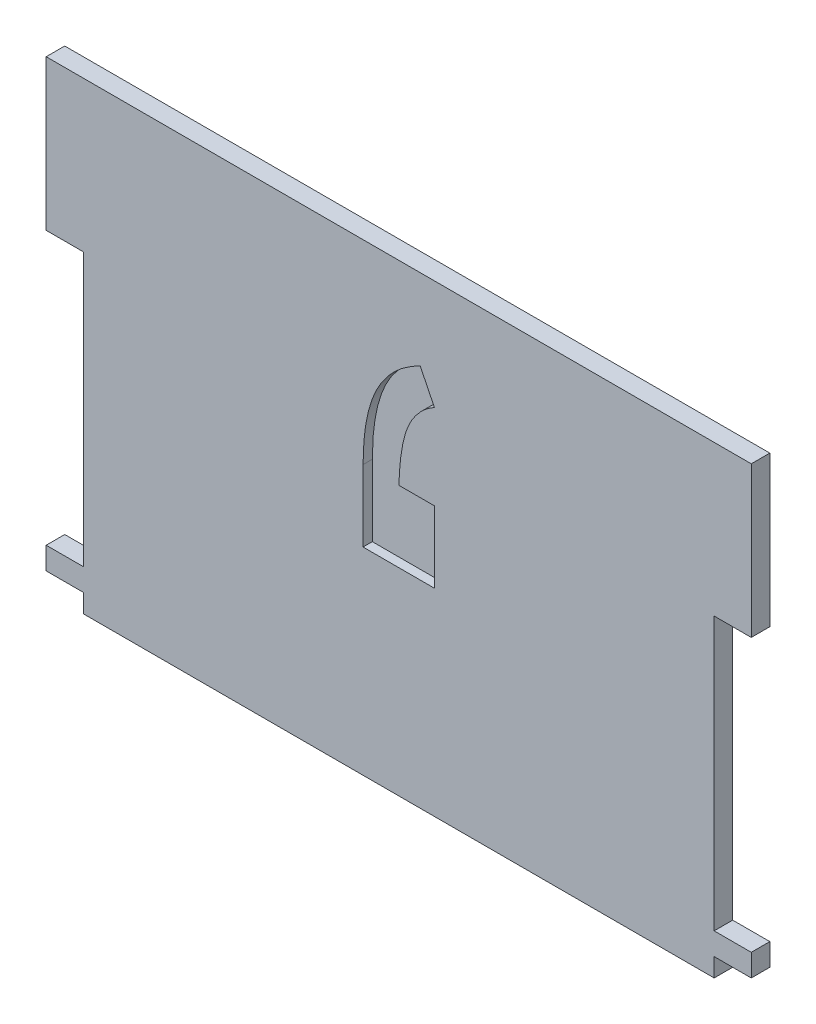
ISO-10303-21;
HEADER;
FILE_DESCRIPTION(('STEP AP214'),'2;1');
FILE_NAME('part.step','',(''),(''),'','','');
FILE_SCHEMA(('AUTOMOTIVE_DESIGN { 1 0 10303 214 1 1 1 1 }'));
ENDSEC;
DATA;
#1=APPLICATION_CONTEXT('core data for automotive mechanical design processes');
#2=APPLICATION_PROTOCOL_DEFINITION('international standard','automotive_design',2000,#1);
#3=PRODUCT_CONTEXT('',#1,'mechanical');
#4=PRODUCT('Part','Part','',(#3));
#5=PRODUCT_RELATED_PRODUCT_CATEGORY('part','',(#4));
#6=PRODUCT_DEFINITION_FORMATION('','',#4);
#7=PRODUCT_DEFINITION_CONTEXT('part definition',#1,'design');
#8=PRODUCT_DEFINITION('design','',#6,#7);
#9=PRODUCT_DEFINITION_SHAPE('','',#8);
#10=(LENGTH_UNIT() NAMED_UNIT(*) SI_UNIT(.MILLI.,.METRE.));
#11=(NAMED_UNIT(*) PLANE_ANGLE_UNIT() SI_UNIT($,.RADIAN.));
#12=(NAMED_UNIT(*) SI_UNIT($,.STERADIAN.) SOLID_ANGLE_UNIT());
#13=UNCERTAINTY_MEASURE_WITH_UNIT(LENGTH_MEASURE(1.E-05),#10,'distance_accuracy_value','');
#14=(GEOMETRIC_REPRESENTATION_CONTEXT(3) GLOBAL_UNCERTAINTY_ASSIGNED_CONTEXT((#13)) GLOBAL_UNIT_ASSIGNED_CONTEXT((#10,
#11,#12)) REPRESENTATION_CONTEXT('',''));
#15=CARTESIAN_POINT('',(0.,0.,0.));
#16=DIRECTION('',(0.,0.,1.));
#17=DIRECTION('',(1.,0.,0.));
#18=AXIS2_PLACEMENT_3D('',#15,#16,#17);
#19=CARTESIAN_POINT('',(0.,0.,1.));
#20=DIRECTION('',(0.,0.,-1.));
#21=DIRECTION('',(-1.,0.,0.));
#22=AXIS2_PLACEMENT_3D('',#19,#20,#21);
#23=PLANE('',#22);
#24=DIRECTION('',(1.,0.,0.));
#25=VECTOR('',#24,1.);
#26=CARTESIAN_POINT('',(-19.,1.5,1.));
#27=LINE('',#26,#25);
#28=CARTESIAN_POINT('',(-19.,1.5,1.));
#29=VERTEX_POINT('',#28);
#30=CARTESIAN_POINT('',(-17.,1.5,1.));
#31=VERTEX_POINT('',#30);
#32=EDGE_CURVE('E418',#29,#31,#27,.T.);
#33=ORIENTED_EDGE('',*,*,#32,.T.);
#34=DIRECTION('',(0.,-1.,0.));
#35=VECTOR('',#34,1.);
#36=CARTESIAN_POINT('',(-17.,1.5,1.));
#37=LINE('',#36,#35);
#38=CARTESIAN_POINT('',(-17.,0.5,1.));
#39=VERTEX_POINT('',#38);
#40=EDGE_CURVE('E466',#31,#39,#37,.T.);
#41=ORIENTED_EDGE('',*,*,#40,.T.);
#42=DIRECTION('',(1.,0.,0.));
#43=VECTOR('',#42,1.);
#44=CARTESIAN_POINT('',(-17.,0.5,1.));
#45=LINE('',#44,#43);
#46=CARTESIAN_POINT('',(17.,0.5,1.));
#47=VERTEX_POINT('',#46);
#48=EDGE_CURVE('E387',#39,#47,#45,.T.);
#49=ORIENTED_EDGE('',*,*,#48,.T.);
#50=DIRECTION('',(0.,1.,0.));
#51=VECTOR('',#50,1.);
#52=CARTESIAN_POINT('',(17.,0.5,1.));
#53=LINE('',#52,#51);
#54=CARTESIAN_POINT('',(17.,1.5,1.));
#55=VERTEX_POINT('',#54);
#56=EDGE_CURVE('E464',#47,#55,#53,.T.);
#57=ORIENTED_EDGE('',*,*,#56,.T.);
#58=DIRECTION('',(1.,0.,0.));
#59=VECTOR('',#58,1.);
#60=CARTESIAN_POINT('',(17.,1.5,1.));
#61=LINE('',#60,#59);
#62=CARTESIAN_POINT('',(19.,1.5,1.));
#63=VERTEX_POINT('',#62);
#64=EDGE_CURVE('E463',#55,#63,#61,.T.);
#65=ORIENTED_EDGE('',*,*,#64,.T.);
#66=DIRECTION('',(0.,1.,0.));
#67=VECTOR('',#66,1.);
#68=CARTESIAN_POINT('',(19.,1.5,1.));
#69=LINE('',#68,#67);
#70=CARTESIAN_POINT('',(19.,2.7,1.));
#71=VERTEX_POINT('',#70);
#72=EDGE_CURVE('E469',#63,#71,#69,.T.);
#73=ORIENTED_EDGE('',*,*,#72,.T.);
#74=DIRECTION('',(-1.,0.,0.));
#75=VECTOR('',#74,1.);
#76=CARTESIAN_POINT('',(19.,2.7,1.));
#77=LINE('',#76,#75);
#78=CARTESIAN_POINT('',(17.,2.7,1.));
#79=VERTEX_POINT('',#78);
#80=EDGE_CURVE('E474',#71,#79,#77,.T.);
#81=ORIENTED_EDGE('',*,*,#80,.T.);
#82=DIRECTION('',(0.,1.,0.));
#83=VECTOR('',#82,1.);
#84=CARTESIAN_POINT('',(17.,2.7,1.));
#85=LINE('',#84,#83);
#86=CARTESIAN_POINT('',(17.,17.3947217067352,1.));
#87=VERTEX_POINT('',#86);
#88=EDGE_CURVE('E477',#79,#87,#85,.T.);
#89=ORIENTED_EDGE('',*,*,#88,.T.);
#90=DIRECTION('',(1.,0.,0.));
#91=VECTOR('',#90,1.);
#92=CARTESIAN_POINT('',(17.,17.3947217067352,1.));
#93=LINE('',#92,#91);
#94=CARTESIAN_POINT('',(19.,17.3947217067352,1.));
#95=VERTEX_POINT('',#94);
#96=EDGE_CURVE('E480',#87,#95,#93,.T.);
#97=ORIENTED_EDGE('',*,*,#96,.T.);
#98=DIRECTION('',(0.,1.,0.));
#99=VECTOR('',#98,1.);
#100=CARTESIAN_POINT('',(19.,17.3947217067352,1.));
#101=LINE('',#100,#99);
#102=CARTESIAN_POINT('',(19.,25.5,1.));
#103=VERTEX_POINT('',#102);
#104=EDGE_CURVE('E478',#95,#103,#101,.T.);
#105=ORIENTED_EDGE('',*,*,#104,.T.);
#106=DIRECTION('',(-1.,0.,0.));
#107=VECTOR('',#106,1.);
#108=CARTESIAN_POINT('',(19.,25.5,1.));
#109=LINE('',#108,#107);
#110=CARTESIAN_POINT('',(-19.,25.5,1.));
#111=VERTEX_POINT('',#110);
#112=EDGE_CURVE('E482',#103,#111,#109,.T.);
#113=ORIENTED_EDGE('',*,*,#112,.T.);
#114=DIRECTION('',(0.,-1.,0.));
#115=VECTOR('',#114,1.);
#116=CARTESIAN_POINT('',(-19.,25.5,1.));
#117=LINE('',#116,#115);
#118=CARTESIAN_POINT('',(-19.,17.3947217067352,1.));
#119=VERTEX_POINT('',#118);
#120=EDGE_CURVE('E485',#111,#119,#117,.T.);
#121=ORIENTED_EDGE('',*,*,#120,.T.);
#122=DIRECTION('',(1.,0.,0.));
#123=VECTOR('',#122,1.);
#124=CARTESIAN_POINT('',(-19.,17.3947217067352,1.));
#125=LINE('',#124,#123);
#126=CARTESIAN_POINT('',(-17.,17.3947217067352,1.));
#127=VERTEX_POINT('',#126);
#128=EDGE_CURVE('E488',#119,#127,#125,.T.);
#129=ORIENTED_EDGE('',*,*,#128,.T.);
#130=DIRECTION('',(0.,-1.,0.));
#131=VECTOR('',#130,1.);
#132=CARTESIAN_POINT('',(-17.,17.3947217067352,1.));
#133=LINE('',#132,#131);
#134=CARTESIAN_POINT('',(-17.,2.7,1.));
#135=VERTEX_POINT('',#134);
#136=EDGE_CURVE('E486',#127,#135,#133,.T.);
#137=ORIENTED_EDGE('',*,*,#136,.T.);
#138=DIRECTION('',(-1.,0.,0.));
#139=VECTOR('',#138,1.);
#140=CARTESIAN_POINT('',(-17.,2.7,1.));
#141=LINE('',#140,#139);
#142=CARTESIAN_POINT('',(-19.,2.7,1.));
#143=VERTEX_POINT('',#142);
#144=EDGE_CURVE('E487',#135,#143,#141,.T.);
#145=ORIENTED_EDGE('',*,*,#144,.T.);
#146=DIRECTION('',(0.,-1.,0.));
#147=VECTOR('',#146,1.);
#148=CARTESIAN_POINT('',(-19.,2.7,1.));
#149=LINE('',#148,#147);
#150=EDGE_CURVE('E423',#143,#29,#149,.T.);
#151=ORIENTED_EDGE('',*,*,#150,.T.);
#152=EDGE_LOOP('',(#33,#41,#49,#57,#65,#73,#81,#89,#97,#105,#113,#121,#129,#137,#145,#151));
#153=FACE_BOUND('',#152,.T.);
#154=DIRECTION('',(1.,0.,0.));
#155=VECTOR('',#154,1.);
#156=CARTESIAN_POINT('',(0.0120192307692278,15.,1.));
#157=LINE('',#156,#155);
#158=CARTESIAN_POINT('',(0.0120192307692278,15.,1.));
#159=VERTEX_POINT('',#158);
#160=CARTESIAN_POINT('',(1.92307692307692,15.,1.));
#161=VERTEX_POINT('',#160);
#162=EDGE_CURVE('E53',#159,#161,#157,.T.);
#163=ORIENTED_EDGE('',*,*,#162,.T.);
#164=DIRECTION('',(0.,-1.,0.));
#165=VECTOR('',#164,1.);
#166=CARTESIAN_POINT('',(1.92307692307692,15.,1.));
#167=LINE('',#166,#165);
#168=CARTESIAN_POINT('',(1.92307692307692,11.1538461538462,1.));
#169=VERTEX_POINT('',#168);
#170=EDGE_CURVE('E263',#161,#169,#167,.T.);
#171=ORIENTED_EDGE('',*,*,#170,.T.);
#172=DIRECTION('',(-1.,0.,0.));
#173=VECTOR('',#172,1.);
#174=CARTESIAN_POINT('',(1.92307692307692,11.1538461538462,1.));
#175=LINE('',#174,#173);
#176=CARTESIAN_POINT('',(-1.92307692307693,11.1538461538462,1.));
#177=VERTEX_POINT('',#176);
#178=EDGE_CURVE('E256',#169,#177,#175,.T.);
#179=ORIENTED_EDGE('',*,*,#178,.T.);
#180=DIRECTION('',(0.,1.,0.));
#181=VECTOR('',#180,1.);
#182=CARTESIAN_POINT('',(-1.92307692307693,11.1538461538462,1.));
#183=LINE('',#182,#181);
#184=CARTESIAN_POINT('',(-1.92307692307693,15.,1.));
#185=VERTEX_POINT('',#184);
#186=EDGE_CURVE('E247',#177,#185,#183,.T.);
#187=ORIENTED_EDGE('',*,*,#186,.T.);
#188=CARTESIAN_POINT('',(-1.92307692307693,15.,1.));
#189=CARTESIAN_POINT('',(-1.91428347674863,15.3810505492982,1.));
#190=CARTESIAN_POINT('',(-1.89751173149341,16.1078284818168,1.));
#191=CARTESIAN_POINT('',(-1.76072914102215,17.1397191595459,1.));
#192=CARTESIAN_POINT('',(-1.53538346627234,18.0567557613417,1.));
#193=CARTESIAN_POINT('',(-1.21810162011556,18.870165784164,1.));
#194=CARTESIAN_POINT('',(-0.781937433708109,19.5779612250893,1.));
#195=CARTESIAN_POINT('',(-0.24573425601302,20.2023609067078,1.));
#196=CARTESIAN_POINT('',(0.404415870603687,20.7374611649171,1.));
#197=CARTESIAN_POINT('',(0.900608510826339,21.0131468045631,1.));
#198=CARTESIAN_POINT('',(1.15384615384615,21.1538461538462,1.));
#199=B_SPLINE_CURVE_WITH_KNOTS('',3,(#188,#189,#190,#191,#192,#193,#194,#195,#196,#197,#198),
.UNSPECIFIED.,.F.,.F.,(4,1,1,1,1,1,1,1,4),(0.,0.156605034796312,0.298692873218196,
0.426919608278893,0.544057561394536,0.656057591228239,0.766995985444929,0.881083710887764,1.),.UNSPECIFIED.);
#200=CARTESIAN_POINT('',(1.15384615384615,21.1538461538462,1.));
#201=VERTEX_POINT('',#200);
#202=EDGE_CURVE('E241',#185,#201,#199,.T.);
#203=ORIENTED_EDGE('',*,*,#202,.T.);
#204=DIRECTION('',(0.441684025127649,-0.897170676040539,0.));
#205=VECTOR('',#204,1.);
#206=CARTESIAN_POINT('',(1.15384615384615,21.1538461538462,1.));
#207=LINE('',#206,#205);
#208=CARTESIAN_POINT('',(1.92307692307692,19.5913461538462,1.));
#209=VERTEX_POINT('',#208);
#210=EDGE_CURVE('E230',#201,#209,#207,.T.);
#211=ORIENTED_EDGE('',*,*,#210,.T.);
#212=CARTESIAN_POINT('',(1.92307692307692,19.5913461538462,1.));
#213=CARTESIAN_POINT('',(1.77094286688164,19.4963447049698,1.));
#214=CARTESIAN_POINT('',(1.46819876928715,19.3072934916549,1.));
#215=CARTESIAN_POINT('',(1.08303359543179,18.9313058475956,1.));
#216=CARTESIAN_POINT('',(0.751943484761724,18.5007358504448,1.));
#217=CARTESIAN_POINT('',(0.489822240621816,17.9940203563104,1.));
#218=CARTESIAN_POINT('',(0.290655303004371,17.3979837252399,1.));
#219=CARTESIAN_POINT('',(0.147350709441592,16.6998755972471,1.));
#220=CARTESIAN_POINT('',(0.0437232804345663,15.8882556517103,1.));
#221=CARTESIAN_POINT('',(0.0230431865287676,15.3088593132732,1.));
#222=CARTESIAN_POINT('',(0.0120192307692278,15.,1.));
#223=B_SPLINE_CURVE_WITH_KNOTS('',3,(#212,#213,#214,#215,#216,#217,#218,#219,#220,#221,#222),
.UNSPECIFIED.,.F.,.F.,(4,1,1,1,1,1,1,1,4),(0.,0.102774668661639,0.204519784048887,
0.307171967567144,0.413723555049608,0.53054363811896,0.667099473035639,0.822540424705056,1.),.UNSPECIFIED.);
#224=EDGE_CURVE('E240',#209,#159,#223,.T.);
#225=ORIENTED_EDGE('',*,*,#224,.T.);
#226=EDGE_LOOP('',(#163,#171,#179,#187,#203,#211,#225));
#227=FACE_BOUND('',#226,.T.);
#228=ADVANCED_FACE('F39',(#153,#227),#23,.F.);
#229=CARTESIAN_POINT('',(0.,0.,0.));
#230=DIRECTION('',(0.,0.,-1.));
#231=DIRECTION('',(-1.,0.,0.));
#232=AXIS2_PLACEMENT_3D('',#229,#230,#231);
#233=PLANE('',#232);
#234=DIRECTION('',(1.,0.,0.));
#235=VECTOR('',#234,1.);
#236=CARTESIAN_POINT('',(-19.,1.5,0.));
#237=LINE('',#236,#235);
#238=CARTESIAN_POINT('',(-19.,1.5,0.));
#239=VERTEX_POINT('',#238);
#240=CARTESIAN_POINT('',(-17.,1.5,0.));
#241=VERTEX_POINT('',#240);
#242=EDGE_CURVE('E385',#239,#241,#237,.T.);
#243=ORIENTED_EDGE('',*,*,#242,.F.);
#244=DIRECTION('',(0.,-1.,0.));
#245=VECTOR('',#244,1.);
#246=CARTESIAN_POINT('',(-19.,2.7,0.));
#247=LINE('',#246,#245);
#248=CARTESIAN_POINT('',(-19.,2.7,0.));
#249=VERTEX_POINT('',#248);
#250=EDGE_CURVE('E419',#249,#239,#247,.T.);
#251=ORIENTED_EDGE('',*,*,#250,.F.);
#252=DIRECTION('',(-1.,0.,0.));
#253=VECTOR('',#252,1.);
#254=CARTESIAN_POINT('',(-17.,2.7,0.));
#255=LINE('',#254,#253);
#256=CARTESIAN_POINT('',(-17.,2.7,0.));
#257=VERTEX_POINT('',#256);
#258=EDGE_CURVE('E417',#257,#249,#255,.T.);
#259=ORIENTED_EDGE('',*,*,#258,.F.);
#260=DIRECTION('',(0.,-1.,0.));
#261=VECTOR('',#260,1.);
#262=CARTESIAN_POINT('',(-17.,17.3947217067352,0.));
#263=LINE('',#262,#261);
#264=CARTESIAN_POINT('',(-17.,17.3947217067352,0.));
#265=VERTEX_POINT('',#264);
#266=EDGE_CURVE('E413',#265,#257,#263,.T.);
#267=ORIENTED_EDGE('',*,*,#266,.F.);
#268=DIRECTION('',(1.,0.,0.));
#269=VECTOR('',#268,1.);
#270=CARTESIAN_POINT('',(-19.,17.3947217067352,0.));
#271=LINE('',#270,#269);
#272=CARTESIAN_POINT('',(-19.,17.3947217067352,0.));
#273=VERTEX_POINT('',#272);
#274=EDGE_CURVE('E415',#273,#265,#271,.T.);
#275=ORIENTED_EDGE('',*,*,#274,.F.);
#276=DIRECTION('',(0.,-1.,0.));
#277=VECTOR('',#276,1.);
#278=CARTESIAN_POINT('',(-19.,25.5,0.));
#279=LINE('',#278,#277);
#280=CARTESIAN_POINT('',(-19.,25.5,0.));
#281=VERTEX_POINT('',#280);
#282=EDGE_CURVE('E409',#281,#273,#279,.T.);
#283=ORIENTED_EDGE('',*,*,#282,.F.);
#284=DIRECTION('',(-1.,0.,0.));
#285=VECTOR('',#284,1.);
#286=CARTESIAN_POINT('',(19.,25.5,0.));
#287=LINE('',#286,#285);
#288=CARTESIAN_POINT('',(19.,25.5,0.));
#289=VERTEX_POINT('',#288);
#290=EDGE_CURVE('E408',#289,#281,#287,.T.);
#291=ORIENTED_EDGE('',*,*,#290,.F.);
#292=DIRECTION('',(0.,1.,0.));
#293=VECTOR('',#292,1.);
#294=CARTESIAN_POINT('',(19.,17.3947217067352,0.));
#295=LINE('',#294,#293);
#296=CARTESIAN_POINT('',(19.,17.3947217067352,0.));
#297=VERTEX_POINT('',#296);
#298=EDGE_CURVE('E406',#297,#289,#295,.T.);
#299=ORIENTED_EDGE('',*,*,#298,.F.);
#300=DIRECTION('',(1.,0.,0.));
#301=VECTOR('',#300,1.);
#302=CARTESIAN_POINT('',(17.,17.3947217067352,0.));
#303=LINE('',#302,#301);
#304=CARTESIAN_POINT('',(17.,17.3947217067352,0.));
#305=VERTEX_POINT('',#304);
#306=EDGE_CURVE('E402',#305,#297,#303,.T.);
#307=ORIENTED_EDGE('',*,*,#306,.F.);
#308=DIRECTION('',(0.,1.,0.));
#309=VECTOR('',#308,1.);
#310=CARTESIAN_POINT('',(17.,2.7,0.));
#311=LINE('',#310,#309);
#312=CARTESIAN_POINT('',(17.,2.7,0.));
#313=VERTEX_POINT('',#312);
#314=EDGE_CURVE('E405',#313,#305,#311,.T.);
#315=ORIENTED_EDGE('',*,*,#314,.F.);
#316=DIRECTION('',(-1.,0.,0.));
#317=VECTOR('',#316,1.);
#318=CARTESIAN_POINT('',(19.,2.7,0.));
#319=LINE('',#318,#317);
#320=CARTESIAN_POINT('',(19.,2.7,0.));
#321=VERTEX_POINT('',#320);
#322=EDGE_CURVE('E397',#321,#313,#319,.T.);
#323=ORIENTED_EDGE('',*,*,#322,.F.);
#324=DIRECTION('',(0.,1.,0.));
#325=VECTOR('',#324,1.);
#326=CARTESIAN_POINT('',(19.,1.5,0.));
#327=LINE('',#326,#325);
#328=CARTESIAN_POINT('',(19.,1.5,0.));
#329=VERTEX_POINT('',#328);
#330=EDGE_CURVE('E396',#329,#321,#327,.T.);
#331=ORIENTED_EDGE('',*,*,#330,.F.);
#332=DIRECTION('',(1.,0.,0.));
#333=VECTOR('',#332,1.);
#334=CARTESIAN_POINT('',(17.,1.5,0.));
#335=LINE('',#334,#333);
#336=CARTESIAN_POINT('',(17.,1.5,0.));
#337=VERTEX_POINT('',#336);
#338=EDGE_CURVE('E391',#337,#329,#335,.T.);
#339=ORIENTED_EDGE('',*,*,#338,.F.);
#340=DIRECTION('',(0.,1.,0.));
#341=VECTOR('',#340,1.);
#342=CARTESIAN_POINT('',(17.,0.5,0.));
#343=LINE('',#342,#341);
#344=CARTESIAN_POINT('',(17.,0.5,0.));
#345=VERTEX_POINT('',#344);
#346=EDGE_CURVE('E393',#345,#337,#343,.T.);
#347=ORIENTED_EDGE('',*,*,#346,.F.);
#348=DIRECTION('',(1.,0.,0.));
#349=VECTOR('',#348,1.);
#350=CARTESIAN_POINT('',(-17.,0.5,0.));
#351=LINE('',#350,#349);
#352=CARTESIAN_POINT('',(-17.,0.5,0.));
#353=VERTEX_POINT('',#352);
#354=EDGE_CURVE('E382',#353,#345,#351,.T.);
#355=ORIENTED_EDGE('',*,*,#354,.F.);
#356=DIRECTION('',(0.,-1.,0.));
#357=VECTOR('',#356,1.);
#358=CARTESIAN_POINT('',(-17.,1.5,0.));
#359=LINE('',#358,#357);
#360=EDGE_CURVE('E371',#241,#353,#359,.T.);
#361=ORIENTED_EDGE('',*,*,#360,.F.);
#362=EDGE_LOOP('',(#243,#251,#259,#267,#275,#283,#291,#299,#307,#315,#323,#331,#339,#347,#355,#361));
#363=FACE_BOUND('',#362,.T.);
#364=DIRECTION('',(0.,-1.,0.));
#365=VECTOR('',#364,1.);
#366=CARTESIAN_POINT('',(-1.92307692307691,6.92307692307692,0.));
#367=LINE('',#366,#365);
#368=CARTESIAN_POINT('',(-1.92307692307691,6.92307692307692,0.));
#369=VERTEX_POINT('',#368);
#370=CARTESIAN_POINT('',(-1.92307692307691,3.07692307692308,0.));
#371=VERTEX_POINT('',#370);
#372=EDGE_CURVE('E541',#369,#371,#367,.T.);
#373=ORIENTED_EDGE('',*,*,#372,.T.);
#374=DIRECTION('',(1.,0.,0.));
#375=VECTOR('',#374,1.);
#376=CARTESIAN_POINT('',(-1.92307692307691,3.07692307692308,0.));
#377=LINE('',#376,#375);
#378=CARTESIAN_POINT('',(1.92307692307694,3.07692307692308,0.));
#379=VERTEX_POINT('',#378);
#380=EDGE_CURVE('E64',#371,#379,#377,.T.);
#381=ORIENTED_EDGE('',*,*,#380,.T.);
#382=DIRECTION('',(0.,1.,0.));
#383=VECTOR('',#382,1.);
#384=CARTESIAN_POINT('',(1.92307692307694,3.07692307692308,0.));
#385=LINE('',#384,#383);
#386=CARTESIAN_POINT('',(1.92307692307694,6.92307692307692,0.));
#387=VERTEX_POINT('',#386);
#388=EDGE_CURVE('E547',#379,#387,#385,.T.);
#389=ORIENTED_EDGE('',*,*,#388,.T.);
#390=DIRECTION('',(-1.,0.,0.));
#391=VECTOR('',#390,1.);
#392=CARTESIAN_POINT('',(1.92307692307694,6.92307692307692,0.));
#393=LINE('',#392,#391);
#394=EDGE_CURVE('E544',#387,#369,#393,.T.);
#395=ORIENTED_EDGE('',*,*,#394,.T.);
#396=EDGE_LOOP('',(#373,#381,#389,#395));
#397=FACE_BOUND('',#396,.T.);
#398=ADVANCED_FACE('F308',(#363,#397),#233,.T.);
#399=CARTESIAN_POINT('',(-19.,1.5,1.));
#400=DIRECTION('',(0.,1.,0.));
#401=DIRECTION('',(-1.,0.,0.));
#402=AXIS2_PLACEMENT_3D('',#399,#400,#401);
#403=PLANE('',#402);
#404=ORIENTED_EDGE('',*,*,#242,.T.);
#405=DIRECTION('',(0.,0.,-1.));
#406=VECTOR('',#405,1.);
#407=CARTESIAN_POINT('',(-17.,1.5,1.));
#408=LINE('',#407,#406);
#409=EDGE_CURVE('E11',#31,#241,#408,.T.);
#410=ORIENTED_EDGE('',*,*,#409,.F.);
#411=ORIENTED_EDGE('',*,*,#32,.F.);
#412=DIRECTION('',(0.,0.,-1.));
#413=VECTOR('',#412,1.);
#414=CARTESIAN_POINT('',(-19.,1.5,1.));
#415=LINE('',#414,#413);
#416=EDGE_CURVE('E422',#29,#239,#415,.T.);
#417=ORIENTED_EDGE('',*,*,#416,.T.);
#418=EDGE_LOOP('',(#404,#410,#411,#417));
#419=FACE_BOUND('',#418,.T.);
#420=ADVANCED_FACE('F41',(#419),#403,.F.);
#421=CARTESIAN_POINT('',(-17.,1.5,1.));
#422=DIRECTION('',(1.,0.,0.));
#423=DIRECTION('',(0.,0.,-1.));
#424=AXIS2_PLACEMENT_3D('',#421,#422,#423);
#425=PLANE('',#424);
#426=ORIENTED_EDGE('',*,*,#360,.T.);
#427=DIRECTION('',(0.,0.,-1.));
#428=VECTOR('',#427,1.);
#429=CARTESIAN_POINT('',(-17.,0.5,1.));
#430=LINE('',#429,#428);
#431=EDGE_CURVE('E50',#39,#353,#430,.T.);
#432=ORIENTED_EDGE('',*,*,#431,.F.);
#433=ORIENTED_EDGE('',*,*,#40,.F.);
#434=ORIENTED_EDGE('',*,*,#409,.T.);
#435=EDGE_LOOP('',(#426,#432,#433,#434));
#436=FACE_BOUND('',#435,.T.);
#437=ADVANCED_FACE('F362',(#436),#425,.F.);
#438=CARTESIAN_POINT('',(-17.,0.5,1.));
#439=DIRECTION('',(0.,1.,0.));
#440=DIRECTION('',(0.,0.,1.));
#441=AXIS2_PLACEMENT_3D('',#438,#439,#440);
#442=PLANE('',#441);
#443=ORIENTED_EDGE('',*,*,#354,.T.);
#444=DIRECTION('',(0.,0.,-1.));
#445=VECTOR('',#444,1.);
#446=CARTESIAN_POINT('',(17.,0.5,1.));
#447=LINE('',#446,#445);
#448=EDGE_CURVE('E389',#47,#345,#447,.T.);
#449=ORIENTED_EDGE('',*,*,#448,.F.);
#450=ORIENTED_EDGE('',*,*,#48,.F.);
#451=ORIENTED_EDGE('',*,*,#431,.T.);
#452=EDGE_LOOP('',(#443,#449,#450,#451));
#453=FACE_BOUND('',#452,.T.);
#454=ADVANCED_FACE('F361',(#453),#442,.F.);
#455=CARTESIAN_POINT('',(17.,0.5,1.));
#456=DIRECTION('',(-1.,0.,0.));
#457=DIRECTION('',(0.,0.,1.));
#458=AXIS2_PLACEMENT_3D('',#455,#456,#457);
#459=PLANE('',#458);
#460=ORIENTED_EDGE('',*,*,#346,.T.);
#461=DIRECTION('',(0.,0.,-1.));
#462=VECTOR('',#461,1.);
#463=CARTESIAN_POINT('',(17.,1.5,1.));
#464=LINE('',#463,#462);
#465=EDGE_CURVE('E457',#55,#337,#464,.T.);
#466=ORIENTED_EDGE('',*,*,#465,.F.);
#467=ORIENTED_EDGE('',*,*,#56,.F.);
#468=ORIENTED_EDGE('',*,*,#448,.T.);
#469=EDGE_LOOP('',(#460,#466,#467,#468));
#470=FACE_BOUND('',#469,.T.);
#471=ADVANCED_FACE('F360',(#470),#459,.F.);
#472=CARTESIAN_POINT('',(17.,1.5,1.));
#473=DIRECTION('',(0.,1.,0.));
#474=DIRECTION('',(-1.,0.,0.));
#475=AXIS2_PLACEMENT_3D('',#472,#473,#474);
#476=PLANE('',#475);
#477=ORIENTED_EDGE('',*,*,#338,.T.);
#478=DIRECTION('',(0.,0.,-1.));
#479=VECTOR('',#478,1.);
#480=CARTESIAN_POINT('',(19.,1.5,1.));
#481=LINE('',#480,#479);
#482=EDGE_CURVE('E454',#63,#329,#481,.T.);
#483=ORIENTED_EDGE('',*,*,#482,.F.);
#484=ORIENTED_EDGE('',*,*,#64,.F.);
#485=ORIENTED_EDGE('',*,*,#465,.T.);
#486=EDGE_LOOP('',(#477,#483,#484,#485));
#487=FACE_BOUND('',#486,.T.);
#488=ADVANCED_FACE('F351',(#487),#476,.F.);
#489=CARTESIAN_POINT('',(19.,1.5,1.));
#490=DIRECTION('',(-1.,0.,0.));
#491=DIRECTION('',(0.,0.,1.));
#492=AXIS2_PLACEMENT_3D('',#489,#490,#491);
#493=PLANE('',#492);
#494=ORIENTED_EDGE('',*,*,#330,.T.);
#495=DIRECTION('',(0.,0.,-1.));
#496=VECTOR('',#495,1.);
#497=CARTESIAN_POINT('',(19.,2.7,1.));
#498=LINE('',#497,#496);
#499=EDGE_CURVE('E455',#71,#321,#498,.T.);
#500=ORIENTED_EDGE('',*,*,#499,.F.);
#501=ORIENTED_EDGE('',*,*,#72,.F.);
#502=ORIENTED_EDGE('',*,*,#482,.T.);
#503=EDGE_LOOP('',(#494,#500,#501,#502));
#504=FACE_BOUND('',#503,.T.);
#505=ADVANCED_FACE('F350',(#504),#493,.F.);
#506=CARTESIAN_POINT('',(19.,2.7,1.));
#507=DIRECTION('',(0.,-1.,0.));
#508=DIRECTION('',(0.,0.,-1.));
#509=AXIS2_PLACEMENT_3D('',#506,#507,#508);
#510=PLANE('',#509);
#511=ORIENTED_EDGE('',*,*,#322,.T.);
#512=DIRECTION('',(0.,0.,-1.));
#513=VECTOR('',#512,1.);
#514=CARTESIAN_POINT('',(17.,2.7,1.));
#515=LINE('',#514,#513);
#516=EDGE_CURVE('E447',#79,#313,#515,.T.);
#517=ORIENTED_EDGE('',*,*,#516,.F.);
#518=ORIENTED_EDGE('',*,*,#80,.F.);
#519=ORIENTED_EDGE('',*,*,#499,.T.);
#520=EDGE_LOOP('',(#511,#517,#518,#519));
#521=FACE_BOUND('',#520,.T.);
#522=ADVANCED_FACE('F343',(#521),#510,.F.);
#523=CARTESIAN_POINT('',(17.,2.7,1.));
#524=DIRECTION('',(-1.,0.,0.));
#525=DIRECTION('',(0.,0.,1.));
#526=AXIS2_PLACEMENT_3D('',#523,#524,#525);
#527=PLANE('',#526);
#528=ORIENTED_EDGE('',*,*,#314,.T.);
#529=DIRECTION('',(0.,0.,-1.));
#530=VECTOR('',#529,1.);
#531=CARTESIAN_POINT('',(17.,17.3947217067352,1.));
#532=LINE('',#531,#530);
#533=EDGE_CURVE('E446',#87,#305,#532,.T.);
#534=ORIENTED_EDGE('',*,*,#533,.F.);
#535=ORIENTED_EDGE('',*,*,#88,.F.);
#536=ORIENTED_EDGE('',*,*,#516,.T.);
#537=EDGE_LOOP('',(#528,#534,#535,#536));
#538=FACE_BOUND('',#537,.T.);
#539=ADVANCED_FACE('F342',(#538),#527,.F.);
#540=CARTESIAN_POINT('',(17.,17.3947217067352,1.));
#541=DIRECTION('',(0.,1.,0.));
#542=DIRECTION('',(0.,0.,1.));
#543=AXIS2_PLACEMENT_3D('',#540,#541,#542);
#544=PLANE('',#543);
#545=ORIENTED_EDGE('',*,*,#306,.T.);
#546=DIRECTION('',(0.,0.,-1.));
#547=VECTOR('',#546,1.);
#548=CARTESIAN_POINT('',(19.,17.3947217067352,1.));
#549=LINE('',#548,#547);
#550=EDGE_CURVE('E441',#95,#297,#549,.T.);
#551=ORIENTED_EDGE('',*,*,#550,.F.);
#552=ORIENTED_EDGE('',*,*,#96,.F.);
#553=ORIENTED_EDGE('',*,*,#533,.T.);
#554=EDGE_LOOP('',(#545,#551,#552,#553));
#555=FACE_BOUND('',#554,.T.);
#556=ADVANCED_FACE('F340',(#555),#544,.F.);
#557=CARTESIAN_POINT('',(19.,17.3947217067352,1.));
#558=DIRECTION('',(-1.,0.,0.));
#559=DIRECTION('',(0.,0.,1.));
#560=AXIS2_PLACEMENT_3D('',#557,#558,#559);
#561=PLANE('',#560);
#562=ORIENTED_EDGE('',*,*,#298,.T.);
#563=DIRECTION('',(0.,0.,-1.));
#564=VECTOR('',#563,1.);
#565=CARTESIAN_POINT('',(19.,25.5,1.));
#566=LINE('',#565,#564);
#567=EDGE_CURVE('E439',#103,#289,#566,.T.);
#568=ORIENTED_EDGE('',*,*,#567,.F.);
#569=ORIENTED_EDGE('',*,*,#104,.F.);
#570=ORIENTED_EDGE('',*,*,#550,.T.);
#571=EDGE_LOOP('',(#562,#568,#569,#570));
#572=FACE_BOUND('',#571,.T.);
#573=ADVANCED_FACE('F335',(#572),#561,.F.);
#574=CARTESIAN_POINT('',(19.,25.5,1.));
#575=DIRECTION('',(0.,-1.,0.));
#576=DIRECTION('',(0.,0.,-1.));
#577=AXIS2_PLACEMENT_3D('',#574,#575,#576);
#578=PLANE('',#577);
#579=ORIENTED_EDGE('',*,*,#290,.T.);
#580=DIRECTION('',(0.,0.,-1.));
#581=VECTOR('',#580,1.);
#582=CARTESIAN_POINT('',(-19.,25.5,1.));
#583=LINE('',#582,#581);
#584=EDGE_CURVE('E437',#111,#281,#583,.T.);
#585=ORIENTED_EDGE('',*,*,#584,.F.);
#586=ORIENTED_EDGE('',*,*,#112,.F.);
#587=ORIENTED_EDGE('',*,*,#567,.T.);
#588=EDGE_LOOP('',(#579,#585,#586,#587));
#589=FACE_BOUND('',#588,.T.);
#590=ADVANCED_FACE('F326',(#589),#578,.F.);
#591=CARTESIAN_POINT('',(-19.,25.5,1.));
#592=DIRECTION('',(1.,0.,0.));
#593=DIRECTION('',(0.,0.,-1.));
#594=AXIS2_PLACEMENT_3D('',#591,#592,#593);
#595=PLANE('',#594);
#596=ORIENTED_EDGE('',*,*,#282,.T.);
#597=DIRECTION('',(0.,0.,-1.));
#598=VECTOR('',#597,1.);
#599=CARTESIAN_POINT('',(-19.,17.3947217067352,1.));
#600=LINE('',#599,#598);
#601=EDGE_CURVE('E431',#119,#273,#600,.T.);
#602=ORIENTED_EDGE('',*,*,#601,.F.);
#603=ORIENTED_EDGE('',*,*,#120,.F.);
#604=ORIENTED_EDGE('',*,*,#584,.T.);
#605=EDGE_LOOP('',(#596,#602,#603,#604));
#606=FACE_BOUND('',#605,.T.);
#607=ADVANCED_FACE('F324',(#606),#595,.F.);
#608=CARTESIAN_POINT('',(-19.,17.3947217067352,1.));
#609=DIRECTION('',(0.,1.,0.));
#610=DIRECTION('',(0.,0.,1.));
#611=AXIS2_PLACEMENT_3D('',#608,#609,#610);
#612=PLANE('',#611);
#613=ORIENTED_EDGE('',*,*,#274,.T.);
#614=DIRECTION('',(0.,0.,-1.));
#615=VECTOR('',#614,1.);
#616=CARTESIAN_POINT('',(-17.,17.3947217067352,1.));
#617=LINE('',#616,#615);
#618=EDGE_CURVE('E432',#127,#265,#617,.T.);
#619=ORIENTED_EDGE('',*,*,#618,.F.);
#620=ORIENTED_EDGE('',*,*,#128,.F.);
#621=ORIENTED_EDGE('',*,*,#601,.T.);
#622=EDGE_LOOP('',(#613,#619,#620,#621));
#623=FACE_BOUND('',#622,.T.);
#624=ADVANCED_FACE('F321',(#623),#612,.F.);
#625=CARTESIAN_POINT('',(-17.,17.3947217067352,1.));
#626=DIRECTION('',(1.,0.,0.));
#627=DIRECTION('',(0.,0.,-1.));
#628=AXIS2_PLACEMENT_3D('',#625,#626,#627);
#629=PLANE('',#628);
#630=ORIENTED_EDGE('',*,*,#266,.T.);
#631=DIRECTION('',(0.,0.,-1.));
#632=VECTOR('',#631,1.);
#633=CARTESIAN_POINT('',(-17.,2.7,1.));
#634=LINE('',#633,#632);
#635=EDGE_CURVE('E426',#135,#257,#634,.T.);
#636=ORIENTED_EDGE('',*,*,#635,.F.);
#637=ORIENTED_EDGE('',*,*,#136,.F.);
#638=ORIENTED_EDGE('',*,*,#618,.T.);
#639=EDGE_LOOP('',(#630,#636,#637,#638));
#640=FACE_BOUND('',#639,.T.);
#641=ADVANCED_FACE('F320',(#640),#629,.F.);
#642=CARTESIAN_POINT('',(-17.,2.7,1.));
#643=DIRECTION('',(0.,-1.,0.));
#644=DIRECTION('',(0.,0.,-1.));
#645=AXIS2_PLACEMENT_3D('',#642,#643,#644);
#646=PLANE('',#645);
#647=ORIENTED_EDGE('',*,*,#258,.T.);
#648=DIRECTION('',(0.,0.,-1.));
#649=VECTOR('',#648,1.);
#650=CARTESIAN_POINT('',(-19.,2.7,1.));
#651=LINE('',#650,#649);
#652=EDGE_CURVE('E421',#143,#249,#651,.T.);
#653=ORIENTED_EDGE('',*,*,#652,.F.);
#654=ORIENTED_EDGE('',*,*,#144,.F.);
#655=ORIENTED_EDGE('',*,*,#635,.T.);
#656=EDGE_LOOP('',(#647,#653,#654,#655));
#657=FACE_BOUND('',#656,.T.);
#658=ADVANCED_FACE('F313',(#657),#646,.F.);
#659=CARTESIAN_POINT('',(-19.,2.7,1.));
#660=DIRECTION('',(1.,0.,0.));
#661=DIRECTION('',(0.,0.,-1.));
#662=AXIS2_PLACEMENT_3D('',#659,#660,#661);
#663=PLANE('',#662);
#664=ORIENTED_EDGE('',*,*,#250,.T.);
#665=ORIENTED_EDGE('',*,*,#416,.F.);
#666=ORIENTED_EDGE('',*,*,#150,.F.);
#667=ORIENTED_EDGE('',*,*,#652,.T.);
#668=EDGE_LOOP('',(#664,#665,#666,#667));
#669=FACE_BOUND('',#668,.T.);
#670=ADVANCED_FACE('F301',(#669),#663,.F.);
#671=CARTESIAN_POINT('',(-1.92307692307691,3.07692307692308,0.5));
#672=DIRECTION('',(0.,1.,0.));
#673=DIRECTION('',(0.,0.,1.));
#674=AXIS2_PLACEMENT_3D('',#671,#672,#673);
#675=PLANE('',#674);
#676=ORIENTED_EDGE('',*,*,#380,.F.);
#677=DIRECTION('',(0.,0.,-1.));
#678=VECTOR('',#677,1.);
#679=CARTESIAN_POINT('',(-1.92307692307691,3.07692307692308,0.5));
#680=LINE('',#679,#678);
#681=CARTESIAN_POINT('',(-1.92307692307691,3.07692307692308,0.5));
#682=VERTEX_POINT('',#681);
#683=EDGE_CURVE('E538',#682,#371,#680,.T.);
#684=ORIENTED_EDGE('',*,*,#683,.F.);
#685=DIRECTION('',(1.,0.,0.));
#686=VECTOR('',#685,1.);
#687=CARTESIAN_POINT('',(-1.92307692307691,3.07692307692308,0.5));
#688=LINE('',#687,#686);
#689=CARTESIAN_POINT('',(1.92307692307694,3.07692307692308,0.5));
#690=VERTEX_POINT('',#689);
#691=EDGE_CURVE('E542',#682,#690,#688,.T.);
#692=ORIENTED_EDGE('',*,*,#691,.T.);
#693=DIRECTION('',(0.,0.,-1.));
#694=VECTOR('',#693,1.);
#695=CARTESIAN_POINT('',(1.92307692307694,3.07692307692308,0.5));
#696=LINE('',#695,#694);
#697=EDGE_CURVE('E495',#690,#379,#696,.T.);
#698=ORIENTED_EDGE('',*,*,#697,.T.);
#699=EDGE_LOOP('',(#676,#684,#692,#698));
#700=FACE_BOUND('',#699,.T.);
#701=ADVANCED_FACE('F296',(#700),#675,.T.);
#702=CARTESIAN_POINT('',(1.92307692307694,3.07692307692308,0.5));
#703=DIRECTION('',(-1.,0.,0.));
#704=DIRECTION('',(0.,0.,1.));
#705=AXIS2_PLACEMENT_3D('',#702,#703,#704);
#706=PLANE('',#705);
#707=ORIENTED_EDGE('',*,*,#388,.F.);
#708=ORIENTED_EDGE('',*,*,#697,.F.);
#709=DIRECTION('',(0.,1.,0.));
#710=VECTOR('',#709,1.);
#711=CARTESIAN_POINT('',(1.92307692307694,3.07692307692308,0.5));
#712=LINE('',#711,#710);
#713=CARTESIAN_POINT('',(1.92307692307694,6.92307692307692,0.5));
#714=VERTEX_POINT('',#713);
#715=EDGE_CURVE('E553',#690,#714,#712,.T.);
#716=ORIENTED_EDGE('',*,*,#715,.T.);
#717=DIRECTION('',(0.,0.,-1.));
#718=VECTOR('',#717,1.);
#719=CARTESIAN_POINT('',(1.92307692307694,6.92307692307692,0.5));
#720=LINE('',#719,#718);
#721=EDGE_CURVE('E493',#714,#387,#720,.T.);
#722=ORIENTED_EDGE('',*,*,#721,.T.);
#723=EDGE_LOOP('',(#707,#708,#716,#722));
#724=FACE_BOUND('',#723,.T.);
#725=ADVANCED_FACE('F293',(#724),#706,.T.);
#726=CARTESIAN_POINT('',(1.92307692307694,6.92307692307692,0.5));
#727=DIRECTION('',(0.,-1.,0.));
#728=DIRECTION('',(0.,0.,-1.));
#729=AXIS2_PLACEMENT_3D('',#726,#727,#728);
#730=PLANE('',#729);
#731=ORIENTED_EDGE('',*,*,#394,.F.);
#732=ORIENTED_EDGE('',*,*,#721,.F.);
#733=DIRECTION('',(-1.,0.,0.));
#734=VECTOR('',#733,1.);
#735=CARTESIAN_POINT('',(1.92307692307694,6.92307692307692,0.5));
#736=LINE('',#735,#734);
#737=CARTESIAN_POINT('',(-1.92307692307691,6.92307692307692,0.5));
#738=VERTEX_POINT('',#737);
#739=EDGE_CURVE('E554',#714,#738,#736,.T.);
#740=ORIENTED_EDGE('',*,*,#739,.T.);
#741=DIRECTION('',(0.,0.,-1.));
#742=VECTOR('',#741,1.);
#743=CARTESIAN_POINT('',(-1.92307692307691,6.92307692307692,0.5));
#744=LINE('',#743,#742);
#745=EDGE_CURVE('E500',#738,#369,#744,.T.);
#746=ORIENTED_EDGE('',*,*,#745,.T.);
#747=EDGE_LOOP('',(#731,#732,#740,#746));
#748=FACE_BOUND('',#747,.T.);
#749=ADVANCED_FACE('F292',(#748),#730,.T.);
#750=CARTESIAN_POINT('',(-1.92307692307691,6.92307692307692,0.5));
#751=DIRECTION('',(1.,0.,0.));
#752=DIRECTION('',(0.,0.,-1.));
#753=AXIS2_PLACEMENT_3D('',#750,#751,#752);
#754=PLANE('',#753);
#755=ORIENTED_EDGE('',*,*,#372,.F.);
#756=ORIENTED_EDGE('',*,*,#745,.F.);
#757=DIRECTION('',(0.,-1.,0.));
#758=VECTOR('',#757,1.);
#759=CARTESIAN_POINT('',(-1.92307692307691,6.92307692307692,0.5));
#760=LINE('',#759,#758);
#761=EDGE_CURVE('E539',#738,#682,#760,.T.);
#762=ORIENTED_EDGE('',*,*,#761,.T.);
#763=ORIENTED_EDGE('',*,*,#683,.T.);
#764=EDGE_LOOP('',(#755,#756,#762,#763));
#765=FACE_BOUND('',#764,.T.);
#766=ADVANCED_FACE('F289',(#765),#754,.T.);
#767=CARTESIAN_POINT('',(0.,0.,0.5));
#768=DIRECTION('',(0.,0.,1.));
#769=DIRECTION('',(1.,0.,0.));
#770=AXIS2_PLACEMENT_3D('',#767,#768,#769);
#771=PLANE('',#770);
#772=ORIENTED_EDGE('',*,*,#691,.F.);
#773=ORIENTED_EDGE('',*,*,#761,.F.);
#774=ORIENTED_EDGE('',*,*,#739,.F.);
#775=ORIENTED_EDGE('',*,*,#715,.F.);
#776=EDGE_LOOP('',(#772,#773,#774,#775));
#777=FACE_BOUND('',#776,.T.);
#778=ADVANCED_FACE('F284',(#777),#771,.F.);
#779=CARTESIAN_POINT('',(0.0120192307692278,15.,0.5));
#780=DIRECTION('',(0.,-1.,0.));
#781=DIRECTION('',(0.,0.,-1.));
#782=AXIS2_PLACEMENT_3D('',#779,#780,#781);
#783=PLANE('',#782);
#784=ORIENTED_EDGE('',*,*,#162,.F.);
#785=DIRECTION('',(0.,0.,1.));
#786=VECTOR('',#785,1.);
#787=CARTESIAN_POINT('',(0.0120192307692278,15.,0.5));
#788=LINE('',#787,#786);
#789=CARTESIAN_POINT('',(0.0120192307692278,15.,0.5));
#790=VERTEX_POINT('',#789);
#791=EDGE_CURVE('E232',#790,#159,#788,.T.);
#792=ORIENTED_EDGE('',*,*,#791,.F.);
#793=DIRECTION('',(1.,0.,0.));
#794=VECTOR('',#793,1.);
#795=CARTESIAN_POINT('',(0.0120192307692278,15.,0.5));
#796=LINE('',#795,#794);
#797=CARTESIAN_POINT('',(1.92307692307692,15.,0.5));
#798=VERTEX_POINT('',#797);
#799=EDGE_CURVE('E238',#790,#798,#796,.T.);
#800=ORIENTED_EDGE('',*,*,#799,.T.);
#801=DIRECTION('',(0.,0.,1.));
#802=VECTOR('',#801,1.);
#803=CARTESIAN_POINT('',(1.92307692307692,15.,0.5));
#804=LINE('',#803,#802);
#805=EDGE_CURVE('E870',#798,#161,#804,.T.);
#806=ORIENTED_EDGE('',*,*,#805,.T.);
#807=EDGE_LOOP('',(#784,#792,#800,#806));
#808=FACE_BOUND('',#807,.T.);
#809=ADVANCED_FACE('F287',(#808),#783,.T.);
#810=CARTESIAN_POINT('',(1.92307692307692,15.,0.5));
#811=DIRECTION('',(-1.,0.,0.));
#812=DIRECTION('',(0.,0.,1.));
#813=AXIS2_PLACEMENT_3D('',#810,#811,#812);
#814=PLANE('',#813);
#815=ORIENTED_EDGE('',*,*,#170,.F.);
#816=ORIENTED_EDGE('',*,*,#805,.F.);
#817=DIRECTION('',(0.,-1.,0.));
#818=VECTOR('',#817,1.);
#819=CARTESIAN_POINT('',(1.92307692307692,15.,0.5));
#820=LINE('',#819,#818);
#821=CARTESIAN_POINT('',(1.92307692307692,11.1538461538462,0.5));
#822=VERTEX_POINT('',#821);
#823=EDGE_CURVE('E558',#798,#822,#820,.T.);
#824=ORIENTED_EDGE('',*,*,#823,.T.);
#825=DIRECTION('',(0.,0.,1.));
#826=VECTOR('',#825,1.);
#827=CARTESIAN_POINT('',(1.92307692307692,11.1538461538462,0.5));
#828=LINE('',#827,#826);
#829=EDGE_CURVE('E866',#822,#169,#828,.T.);
#830=ORIENTED_EDGE('',*,*,#829,.T.);
#831=EDGE_LOOP('',(#815,#816,#824,#830));
#832=FACE_BOUND('',#831,.T.);
#833=ADVANCED_FACE('F583',(#832),#814,.T.);
#834=CARTESIAN_POINT('',(1.92307692307692,11.1538461538462,0.5));
#835=DIRECTION('',(0.,1.,0.));
#836=DIRECTION('',(0.,0.,1.));
#837=AXIS2_PLACEMENT_3D('',#834,#835,#836);
#838=PLANE('',#837);
#839=ORIENTED_EDGE('',*,*,#178,.F.);
#840=ORIENTED_EDGE('',*,*,#829,.F.);
#841=DIRECTION('',(-1.,0.,0.));
#842=VECTOR('',#841,1.);
#843=CARTESIAN_POINT('',(1.92307692307692,11.1538461538462,0.5));
#844=LINE('',#843,#842);
#845=CARTESIAN_POINT('',(-1.92307692307693,11.1538461538462,0.5));
#846=VERTEX_POINT('',#845);
#847=EDGE_CURVE('E565',#822,#846,#844,.T.);
#848=ORIENTED_EDGE('',*,*,#847,.T.);
#849=DIRECTION('',(0.,0.,1.));
#850=VECTOR('',#849,1.);
#851=CARTESIAN_POINT('',(-1.92307692307693,11.1538461538462,0.5));
#852=LINE('',#851,#850);
#853=EDGE_CURVE('E875',#846,#177,#852,.T.);
#854=ORIENTED_EDGE('',*,*,#853,.T.);
#855=EDGE_LOOP('',(#839,#840,#848,#854));
#856=FACE_BOUND('',#855,.T.);
#857=ADVANCED_FACE('F579',(#856),#838,.T.);
#858=CARTESIAN_POINT('',(-1.92307692307693,11.1538461538462,0.5));
#859=DIRECTION('',(1.,0.,0.));
#860=DIRECTION('',(0.,0.,-1.));
#861=AXIS2_PLACEMENT_3D('',#858,#859,#860);
#862=PLANE('',#861);
#863=ORIENTED_EDGE('',*,*,#186,.F.);
#864=ORIENTED_EDGE('',*,*,#853,.F.);
#865=DIRECTION('',(0.,1.,0.));
#866=VECTOR('',#865,1.);
#867=CARTESIAN_POINT('',(-1.92307692307693,11.1538461538462,0.5));
#868=LINE('',#867,#866);
#869=CARTESIAN_POINT('',(-1.92307692307693,15.,0.5));
#870=VERTEX_POINT('',#869);
#871=EDGE_CURVE('E564',#846,#870,#868,.T.);
#872=ORIENTED_EDGE('',*,*,#871,.T.);
#873=DIRECTION('',(0.,0.,1.));
#874=VECTOR('',#873,1.);
#875=CARTESIAN_POINT('',(-1.92307692307693,15.,0.5));
#876=LINE('',#875,#874);
#877=EDGE_CURVE('E880',#870,#185,#876,.T.);
#878=ORIENTED_EDGE('',*,*,#877,.T.);
#879=EDGE_LOOP('',(#863,#864,#872,#878));
#880=FACE_BOUND('',#879,.T.);
#881=ADVANCED_FACE('F574',(#880),#862,.T.);
#882=CARTESIAN_POINT('',(-1.92307692307693,15.,0.5));
#883=CARTESIAN_POINT('',(-1.91428347674863,15.3810505492982,0.5));
#884=CARTESIAN_POINT('',(-1.89751173149341,16.1078284818168,0.5));
#885=CARTESIAN_POINT('',(-1.76072914102215,17.1397191595459,0.5));
#886=CARTESIAN_POINT('',(-1.53538346627234,18.0567557613417,0.5));
#887=CARTESIAN_POINT('',(-1.21810162011556,18.870165784164,0.5));
#888=CARTESIAN_POINT('',(-0.781937433708109,19.5779612250893,0.500000000000001));
#889=CARTESIAN_POINT('',(-0.24573425601302,20.2023609067078,0.5));
#890=CARTESIAN_POINT('',(0.404415870603687,20.7374611649171,0.5));
#891=CARTESIAN_POINT('',(0.900608510826339,21.0131468045631,0.5));
#892=CARTESIAN_POINT('',(1.15384615384615,21.1538461538462,0.5));
#893=B_SPLINE_CURVE_WITH_KNOTS('',3,(#882,#883,#884,#885,#886,#887,#888,#889,#890,#891,#892),
.UNSPECIFIED.,.F.,.F.,(4,1,1,1,1,1,1,1,4),(0.,0.156605034796312,0.298692873218196,
0.426919608278893,0.544057561394536,0.656057591228239,0.766995985444929,0.881083710887764,1.),.UNSPECIFIED.);
#894=DIRECTION('',(0.,0.,1.));
#895=VECTOR('',#894,1.);
#896=SURFACE_OF_LINEAR_EXTRUSION('',#893,#895);
#897=ORIENTED_EDGE('',*,*,#202,.F.);
#898=ORIENTED_EDGE('',*,*,#877,.F.);
#899=CARTESIAN_POINT('',(1.15384615384615,21.1538461538462,0.5));
#900=VERTEX_POINT('',#899);
#901=EDGE_CURVE('E563',#870,#900,#893,.T.);
#902=ORIENTED_EDGE('',*,*,#901,.T.);
#903=DIRECTION('',(0.,0.,1.));
#904=VECTOR('',#903,1.);
#905=CARTESIAN_POINT('',(1.15384615384615,21.1538461538462,0.5));
#906=LINE('',#905,#904);
#907=EDGE_CURVE('E233',#900,#201,#906,.T.);
#908=ORIENTED_EDGE('',*,*,#907,.T.);
#909=EDGE_LOOP('',(#897,#898,#902,#908));
#910=FACE_BOUND('',#909,.T.);
#911=ADVANCED_FACE('F572',(#910),#896,.T.);
#912=CARTESIAN_POINT('',(1.15384615384615,21.1538461538462,0.5));
#913=DIRECTION('',(-0.897170676040539,-0.441684025127649,0.));
#914=DIRECTION('',(0.441684025127649,-0.897170676040539,0.));
#915=AXIS2_PLACEMENT_3D('',#912,#913,#914);
#916=PLANE('',#915);
#917=ORIENTED_EDGE('',*,*,#210,.F.);
#918=ORIENTED_EDGE('',*,*,#907,.F.);
#919=DIRECTION('',(0.441684025127649,-0.897170676040539,0.));
#920=VECTOR('',#919,1.);
#921=CARTESIAN_POINT('',(1.15384615384615,21.1538461538462,0.5));
#922=LINE('',#921,#920);
#923=CARTESIAN_POINT('',(1.92307692307692,19.5913461538462,0.5));
#924=VERTEX_POINT('',#923);
#925=EDGE_CURVE('E229',#900,#924,#922,.T.);
#926=ORIENTED_EDGE('',*,*,#925,.T.);
#927=DIRECTION('',(0.,0.,1.));
#928=VECTOR('',#927,1.);
#929=CARTESIAN_POINT('',(1.92307692307692,19.5913461538462,0.5));
#930=LINE('',#929,#928);
#931=EDGE_CURVE('E225',#924,#209,#930,.T.);
#932=ORIENTED_EDGE('',*,*,#931,.T.);
#933=EDGE_LOOP('',(#917,#918,#926,#932));
#934=FACE_BOUND('',#933,.T.);
#935=ADVANCED_FACE('F222',(#934),#916,.T.);
#936=CARTESIAN_POINT('',(1.92307692307692,19.5913461538462,0.5));
#937=CARTESIAN_POINT('',(1.77094286688164,19.4963447049698,0.5));
#938=CARTESIAN_POINT('',(1.46819876928715,19.3072934916549,0.5));
#939=CARTESIAN_POINT('',(1.08303359543179,18.9313058475956,0.5));
#940=CARTESIAN_POINT('',(0.751943484761724,18.5007358504448,0.5));
#941=CARTESIAN_POINT('',(0.489822240621816,17.9940203563104,0.5));
#942=CARTESIAN_POINT('',(0.290655303004371,17.3979837252399,0.5));
#943=CARTESIAN_POINT('',(0.147350709441592,16.6998755972471,0.5));
#944=CARTESIAN_POINT('',(0.0437232804345663,15.8882556517103,0.5));
#945=CARTESIAN_POINT('',(0.0230431865287676,15.3088593132732,0.5));
#946=CARTESIAN_POINT('',(0.0120192307692278,15.,0.5));
#947=B_SPLINE_CURVE_WITH_KNOTS('',3,(#936,#937,#938,#939,#940,#941,#942,#943,#944,#945,#946),
.UNSPECIFIED.,.F.,.F.,(4,1,1,1,1,1,1,1,4),(0.,0.102774668661639,0.204519784048887,
0.307171967567144,0.413723555049608,0.53054363811896,0.667099473035639,0.822540424705056,1.),.UNSPECIFIED.);
#948=DIRECTION('',(0.,0.,1.));
#949=VECTOR('',#948,1.);
#950=SURFACE_OF_LINEAR_EXTRUSION('',#947,#949);
#951=ORIENTED_EDGE('',*,*,#224,.F.);
#952=ORIENTED_EDGE('',*,*,#931,.F.);
#953=EDGE_CURVE('E262',#924,#790,#947,.T.);
#954=ORIENTED_EDGE('',*,*,#953,.T.);
#955=ORIENTED_EDGE('',*,*,#791,.T.);
#956=EDGE_LOOP('',(#951,#952,#954,#955));
#957=FACE_BOUND('',#956,.T.);
#958=ADVANCED_FACE('F239',(#957),#950,.T.);
#959=CARTESIAN_POINT('',(-1.32423703497494,18.5779143461657,0.5));
#960=DIRECTION('',(0.,0.,1.));
#961=DIRECTION('',(1.,0.,0.));
#962=AXIS2_PLACEMENT_3D('',#959,#960,#961);
#963=PLANE('',#962);
#964=ORIENTED_EDGE('',*,*,#799,.F.);
#965=ORIENTED_EDGE('',*,*,#953,.F.);
#966=ORIENTED_EDGE('',*,*,#925,.F.);
#967=ORIENTED_EDGE('',*,*,#901,.F.);
#968=ORIENTED_EDGE('',*,*,#871,.F.);
#969=ORIENTED_EDGE('',*,*,#847,.F.);
#970=ORIENTED_EDGE('',*,*,#823,.F.);
#971=EDGE_LOOP('',(#964,#965,#966,#967,#968,#969,#970));
#972=FACE_BOUND('',#971,.T.);
#973=ADVANCED_FACE('F277',(#972),#963,.T.);
#974=CLOSED_SHELL('',(#228,#398,#420,#437,#454,#471,#488,#505,#522,#539,#556,#573,#590,#607,
#624,#641,#658,#670,#701,#725,#749,#766,#778,#809,#833,#857,#881,#911,#935,#958,#973));
#975=MANIFOLD_SOLID_BREP('B2',#974);
#976=ADVANCED_BREP_SHAPE_REPRESENTATION('',(#18,#975),#14);
#977=SHAPE_DEFINITION_REPRESENTATION(#9,#976);
ENDSEC;
END-ISO-10303-21;
